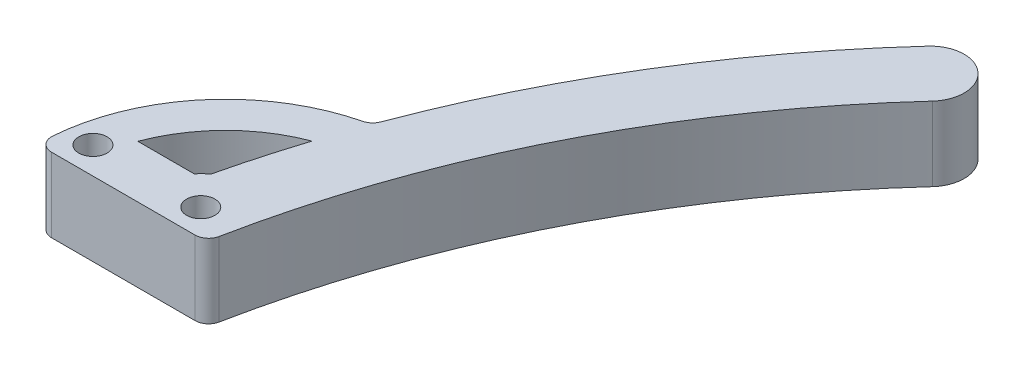
ISO-10303-21;
HEADER;
FILE_DESCRIPTION(('STEP AP214'),'2;1');
FILE_NAME('part.step','',(''),(''),'','','');
FILE_SCHEMA(('AUTOMOTIVE_DESIGN { 1 0 10303 214 1 1 1 1 }'));
ENDSEC;
DATA;
#1=APPLICATION_CONTEXT('core data for automotive mechanical design processes');
#2=APPLICATION_PROTOCOL_DEFINITION('international standard','automotive_design',2000,#1);
#3=PRODUCT_CONTEXT('',#1,'mechanical');
#4=PRODUCT('Part','Part','',(#3));
#5=PRODUCT_RELATED_PRODUCT_CATEGORY('part','',(#4));
#6=PRODUCT_DEFINITION_FORMATION('','',#4);
#7=PRODUCT_DEFINITION_CONTEXT('part definition',#1,'design');
#8=PRODUCT_DEFINITION('design','',#6,#7);
#9=PRODUCT_DEFINITION_SHAPE('','',#8);
#10=(LENGTH_UNIT() NAMED_UNIT(*) SI_UNIT(.MILLI.,.METRE.));
#11=(NAMED_UNIT(*) PLANE_ANGLE_UNIT() SI_UNIT($,.RADIAN.));
#12=(NAMED_UNIT(*) SI_UNIT($,.STERADIAN.) SOLID_ANGLE_UNIT());
#13=UNCERTAINTY_MEASURE_WITH_UNIT(LENGTH_MEASURE(1.E-05),#10,'distance_accuracy_value','');
#14=(GEOMETRIC_REPRESENTATION_CONTEXT(3) GLOBAL_UNCERTAINTY_ASSIGNED_CONTEXT((#13)) GLOBAL_UNIT_ASSIGNED_CONTEXT((#10,
#11,#12)) REPRESENTATION_CONTEXT('',''));
#15=CARTESIAN_POINT('',(0.,0.,0.));
#16=DIRECTION('',(0.,0.,1.));
#17=DIRECTION('',(1.,0.,0.));
#18=AXIS2_PLACEMENT_3D('',#15,#16,#17);
#19=CARTESIAN_POINT('',(-141.446102809515,11.,-27.));
#20=DIRECTION('',(0.,1.,0.));
#21=DIRECTION('',(0.,0.,1.));
#22=AXIS2_PLACEMENT_3D('',#19,#20,#21);
#23=PLANE('',#22);
#24=CARTESIAN_POINT('',(-149.101129521198,11.,-31.));
#25=DIRECTION('',(0.,1.,0.));
#26=DIRECTION('',(0.,0.,1.));
#27=AXIS2_PLACEMENT_3D('',#24,#25,#26);
#28=CIRCLE('',#27,2.09999999999999);
#29=CARTESIAN_POINT('',(-149.101129521198,11.,-28.9));
#30=VERTEX_POINT('',#29);
#31=EDGE_CURVE('E157',#30,#30,#28,.T.);
#32=ORIENTED_EDGE('',*,*,#31,.F.);
#33=EDGE_LOOP('',(#32));
#34=FACE_BOUND('',#33,.T.);
#35=CARTESIAN_POINT('',(-141.446102809515,11.,-27.));
#36=DIRECTION('',(0.,1.,0.));
#37=DIRECTION('',(0.,0.,1.));
#38=AXIS2_PLACEMENT_3D('',#35,#36,#37);
#39=CIRCLE('',#38,27.8705796636837);
#40=CARTESIAN_POINT('',(-148.107725738016,11.,-54.0627417448458));
#41=VERTEX_POINT('',#40);
#42=CARTESIAN_POINT('',(-169.23327325931,11.,-29.154615785653));
#43=VERTEX_POINT('',#42);
#44=EDGE_CURVE('E168',#41,#43,#39,.T.);
#45=ORIENTED_EDGE('',*,*,#44,.T.);
#46=CARTESIAN_POINT('',(-167.239258726057,11.,-29.));
#47=DIRECTION('',(0.,1.,0.));
#48=DIRECTION('',(0.,0.,1.));
#49=AXIS2_PLACEMENT_3D('',#46,#47,#48);
#50=CIRCLE('',#49,2.);
#51=CARTESIAN_POINT('',(-167.239258726057,11.,-27.));
#52=VERTEX_POINT('',#51);
#53=EDGE_CURVE('E214',#43,#52,#50,.T.);
#54=ORIENTED_EDGE('',*,*,#53,.T.);
#55=DIRECTION('',(1.,0.,0.));
#56=VECTOR('',#55,1.);
#57=CARTESIAN_POINT('',(-169.316682473199,11.,-27.));
#58=LINE('',#57,#56);
#59=CARTESIAN_POINT('',(-145.936507084417,11.,-27.));
#60=VERTEX_POINT('',#59);
#61=EDGE_CURVE('E171',#52,#60,#58,.T.);
#62=ORIENTED_EDGE('',*,*,#61,.T.);
#63=CARTESIAN_POINT('',(-145.936507084417,11.,-29.));
#64=DIRECTION('',(0.,1.,0.));
#65=DIRECTION('',(0.,0.,1.));
#66=AXIS2_PLACEMENT_3D('',#63,#64,#65);
#67=CIRCLE('',#66,2.);
#68=CARTESIAN_POINT('',(-143.974863061506,11.,-28.610188856778));
#69=VERTEX_POINT('',#68);
#70=EDGE_CURVE('E48',#60,#69,#67,.T.);
#71=ORIENTED_EDGE('',*,*,#70,.T.);
#72=CARTESIAN_POINT('',(0.,11.,0.));
#73=DIRECTION('',(0.,-1.,0.));
#74=DIRECTION('',(0.,0.,1.));
#75=AXIS2_PLACEMENT_3D('',#72,#73,#74);
#76=CIRCLE('',#75,146.79);
#77=CARTESIAN_POINT('',(-108.437297629025,11.,-98.937639869335));
#78=VERTEX_POINT('',#77);
#79=EDGE_CURVE('E174',#69,#78,#76,.T.);
#80=ORIENTED_EDGE('',*,*,#79,.T.);
#81=CARTESIAN_POINT('',(-112.130917685876,11.,-102.307680058358));
#82=DIRECTION('',(0.,1.,0.));
#83=DIRECTION('',(0.,0.,1.));
#84=AXIS2_PLACEMENT_3D('',#81,#82,#83);
#85=CIRCLE('',#84,5.);
#86=CARTESIAN_POINT('',(-115.824537742727,11.,-105.677720247381));
#87=VERTEX_POINT('',#86);
#88=EDGE_CURVE('E176',#78,#87,#85,.T.);
#89=ORIENTED_EDGE('',*,*,#88,.T.);
#90=CARTESIAN_POINT('',(0.,11.,0.));
#91=DIRECTION('',(0.,1.,0.));
#92=DIRECTION('',(0.,0.,1.));
#93=AXIS2_PLACEMENT_3D('',#90,#91,#92);
#94=CIRCLE('',#93,156.79);
#95=CARTESIAN_POINT('',(-146.714290421652,11.,-55.2993769049094));
#96=VERTEX_POINT('',#95);
#97=EDGE_CURVE('E178',#87,#96,#94,.T.);
#98=ORIENTED_EDGE('',*,*,#97,.T.);
#99=CARTESIAN_POINT('',(-148.585765521105,11.,-56.0047710869989));
#100=DIRECTION('',(0.,1.,0.));
#101=DIRECTION('',(0.,0.,1.));
#102=AXIS2_PLACEMENT_3D('',#99,#100,#101);
#103=CIRCLE('',#102,2.);
#104=EDGE_CURVE('E11',#96,#41,#103,.F.);
#105=ORIENTED_EDGE('',*,*,#104,.T.);
#106=EDGE_LOOP('',(#45,#54,#62,#71,#80,#89,#98,#105));
#107=FACE_BOUND('',#106,.T.);
#108=DIRECTION('',(1.,0.,0.));
#109=VECTOR('',#108,1.);
#110=CARTESIAN_POINT('',(-162.242742421165,11.,-34.7972264792956));
#111=LINE('',#110,#109);
#112=CARTESIAN_POINT('',(-162.242742421165,11.,-34.7972264792956));
#113=VERTEX_POINT('',#112);
#114=CARTESIAN_POINT('',(-153.870589387154,11.,-34.7972264792956));
#115=VERTEX_POINT('',#114);
#116=EDGE_CURVE('E134',#113,#115,#111,.T.);
#117=ORIENTED_EDGE('',*,*,#116,.F.);
#118=CARTESIAN_POINT('',(-141.446102809515,11.,-27.));
#119=DIRECTION('',(0.,1.,0.));
#120=DIRECTION('',(0.,0.,1.));
#121=AXIS2_PLACEMENT_3D('',#118,#119,#120);
#122=CIRCLE('',#121,22.2102895052328);
#123=CARTESIAN_POINT('',(-149.338618997014,11.,-47.7606634801572));
#124=VERTEX_POINT('',#123);
#125=EDGE_CURVE('E124',#124,#113,#122,.T.);
#126=ORIENTED_EDGE('',*,*,#125,.F.);
#127=CARTESIAN_POINT('',(0.,11.,0.));
#128=DIRECTION('',(0.,-1.,0.));
#129=DIRECTION('',(0.,0.,1.));
#130=AXIS2_PLACEMENT_3D('',#127,#128,#129);
#131=CIRCLE('',#130,156.79);
#132=CARTESIAN_POINT('',(-152.603484101656,11.,-35.9900088918527));
#133=VERTEX_POINT('',#132);
#134=EDGE_CURVE('E150',#133,#124,#131,.T.);
#135=ORIENTED_EDGE('',*,*,#134,.F.);
#136=CARTESIAN_POINT('',(-149.101129521198,11.,-31.));
#137=DIRECTION('',(0.,-1.,0.));
#138=DIRECTION('',(0.,0.,1.));
#139=AXIS2_PLACEMENT_3D('',#136,#137,#138);
#140=CIRCLE('',#139,6.09644784674009);
#141=EDGE_CURVE('E148',#115,#133,#140,.T.);
#142=ORIENTED_EDGE('',*,*,#141,.F.);
#143=EDGE_LOOP('',(#117,#126,#135,#142));
#144=FACE_BOUND('',#143,.T.);
#145=CARTESIAN_POINT('',(-165.101129521198,11.,-31.));
#146=DIRECTION('',(0.,1.,0.));
#147=DIRECTION('',(0.,0.,1.));
#148=AXIS2_PLACEMENT_3D('',#145,#146,#147);
#149=CIRCLE('',#148,2.09999999999999);
#150=CARTESIAN_POINT('',(-165.101129521198,11.,-28.9));
#151=VERTEX_POINT('',#150);
#152=EDGE_CURVE('E294',#151,#151,#149,.T.);
#153=ORIENTED_EDGE('',*,*,#152,.F.);
#154=EDGE_LOOP('',(#153));
#155=FACE_BOUND('',#154,.T.);
#156=ADVANCED_FACE('F33',(#34,#107,#144,#155),#23,.T.);
#157=CARTESIAN_POINT('',(-141.446102809515,0.,-27.));
#158=DIRECTION('',(0.,1.,0.));
#159=DIRECTION('',(0.,0.,1.));
#160=AXIS2_PLACEMENT_3D('',#157,#158,#159);
#161=PLANE('',#160);
#162=DIRECTION('',(1.,0.,0.));
#163=VECTOR('',#162,1.);
#164=CARTESIAN_POINT('',(-169.316682473199,0.,-27.));
#165=LINE('',#164,#163);
#166=CARTESIAN_POINT('',(-167.239258726057,0.,-27.));
#167=VERTEX_POINT('',#166);
#168=CARTESIAN_POINT('',(-145.936507084417,0.,-27.));
#169=VERTEX_POINT('',#168);
#170=EDGE_CURVE('E184',#167,#169,#165,.T.);
#171=ORIENTED_EDGE('',*,*,#170,.F.);
#172=CARTESIAN_POINT('',(-167.239258726057,0.,-29.));
#173=DIRECTION('',(0.,1.,0.));
#174=DIRECTION('',(0.,0.,1.));
#175=AXIS2_PLACEMENT_3D('',#172,#173,#174);
#176=CIRCLE('',#175,2.);
#177=CARTESIAN_POINT('',(-169.23327325931,0.,-29.154615785653));
#178=VERTEX_POINT('',#177);
#179=EDGE_CURVE('E211',#167,#178,#176,.F.);
#180=ORIENTED_EDGE('',*,*,#179,.T.);
#181=CARTESIAN_POINT('',(-141.446102809515,0.,-27.));
#182=DIRECTION('',(0.,1.,0.));
#183=DIRECTION('',(0.,0.,1.));
#184=AXIS2_PLACEMENT_3D('',#181,#182,#183);
#185=CIRCLE('',#184,27.8705796636837);
#186=CARTESIAN_POINT('',(-148.107725738016,0.,-54.0627417448458));
#187=VERTEX_POINT('',#186);
#188=EDGE_CURVE('E142',#187,#178,#185,.T.);
#189=ORIENTED_EDGE('',*,*,#188,.F.);
#190=CARTESIAN_POINT('',(-148.585765521105,0.,-56.0047710869989));
#191=DIRECTION('',(0.,1.,0.));
#192=DIRECTION('',(0.,0.,1.));
#193=AXIS2_PLACEMENT_3D('',#190,#191,#192);
#194=CIRCLE('',#193,2.);
#195=CARTESIAN_POINT('',(-146.714290421652,0.,-55.2993769049094));
#196=VERTEX_POINT('',#195);
#197=EDGE_CURVE('E41',#187,#196,#194,.T.);
#198=ORIENTED_EDGE('',*,*,#197,.T.);
#199=CARTESIAN_POINT('',(0.,0.,0.));
#200=DIRECTION('',(0.,1.,0.));
#201=DIRECTION('',(0.,0.,1.));
#202=AXIS2_PLACEMENT_3D('',#199,#200,#201);
#203=CIRCLE('',#202,156.79);
#204=CARTESIAN_POINT('',(-115.824537742727,0.,-105.677720247381));
#205=VERTEX_POINT('',#204);
#206=EDGE_CURVE('E172',#205,#196,#203,.T.);
#207=ORIENTED_EDGE('',*,*,#206,.F.);
#208=CARTESIAN_POINT('',(-112.130917685876,0.,-102.307680058358));
#209=DIRECTION('',(0.,1.,0.));
#210=DIRECTION('',(0.,0.,1.));
#211=AXIS2_PLACEMENT_3D('',#208,#209,#210);
#212=CIRCLE('',#211,5.);
#213=CARTESIAN_POINT('',(-108.437297629025,0.,-98.937639869335));
#214=VERTEX_POINT('',#213);
#215=EDGE_CURVE('E189',#214,#205,#212,.T.);
#216=ORIENTED_EDGE('',*,*,#215,.F.);
#217=CARTESIAN_POINT('',(0.,0.,0.));
#218=DIRECTION('',(0.,-1.,0.));
#219=DIRECTION('',(0.,0.,1.));
#220=AXIS2_PLACEMENT_3D('',#217,#218,#219);
#221=CIRCLE('',#220,146.79);
#222=CARTESIAN_POINT('',(-143.974863061506,0.,-28.610188856778));
#223=VERTEX_POINT('',#222);
#224=EDGE_CURVE('E187',#223,#214,#221,.T.);
#225=ORIENTED_EDGE('',*,*,#224,.F.);
#226=CARTESIAN_POINT('',(-145.936507084417,0.,-29.));
#227=DIRECTION('',(0.,1.,0.));
#228=DIRECTION('',(0.,0.,1.));
#229=AXIS2_PLACEMENT_3D('',#226,#227,#228);
#230=CIRCLE('',#229,2.);
#231=EDGE_CURVE('E56',#223,#169,#230,.F.);
#232=ORIENTED_EDGE('',*,*,#231,.T.);
#233=EDGE_LOOP('',(#171,#180,#189,#198,#207,#216,#225,#232));
#234=FACE_BOUND('',#233,.T.);
#235=CARTESIAN_POINT('',(-141.446102809515,0.,-27.));
#236=DIRECTION('',(0.,1.,0.));
#237=DIRECTION('',(0.,0.,1.));
#238=AXIS2_PLACEMENT_3D('',#235,#236,#237);
#239=CIRCLE('',#238,22.2102895052328);
#240=CARTESIAN_POINT('',(-149.338618997014,0.,-47.7606634801572));
#241=VERTEX_POINT('',#240);
#242=CARTESIAN_POINT('',(-162.242742421165,0.,-34.7972264792956));
#243=VERTEX_POINT('',#242);
#244=EDGE_CURVE('E155',#241,#243,#239,.T.);
#245=ORIENTED_EDGE('',*,*,#244,.T.);
#246=DIRECTION('',(1.,0.,0.));
#247=VECTOR('',#246,1.);
#248=CARTESIAN_POINT('',(-162.242742421165,0.,-34.7972264792956));
#249=LINE('',#248,#247);
#250=CARTESIAN_POINT('',(-153.870589387154,0.,-34.7972264792956));
#251=VERTEX_POINT('',#250);
#252=EDGE_CURVE('E141',#243,#251,#249,.T.);
#253=ORIENTED_EDGE('',*,*,#252,.T.);
#254=CARTESIAN_POINT('',(-149.101129521198,0.,-31.));
#255=DIRECTION('',(0.,-1.,0.));
#256=DIRECTION('',(0.,0.,1.));
#257=AXIS2_PLACEMENT_3D('',#254,#255,#256);
#258=CIRCLE('',#257,6.09644784674009);
#259=CARTESIAN_POINT('',(-152.603484101656,0.,-35.9900088918527));
#260=VERTEX_POINT('',#259);
#261=EDGE_CURVE('E159',#251,#260,#258,.T.);
#262=ORIENTED_EDGE('',*,*,#261,.T.);
#263=CARTESIAN_POINT('',(0.,0.,0.));
#264=DIRECTION('',(0.,-1.,0.));
#265=DIRECTION('',(0.,0.,1.));
#266=AXIS2_PLACEMENT_3D('',#263,#264,#265);
#267=CIRCLE('',#266,156.79);
#268=EDGE_CURVE('E135',#260,#241,#267,.T.);
#269=ORIENTED_EDGE('',*,*,#268,.T.);
#270=EDGE_LOOP('',(#245,#253,#262,#269));
#271=FACE_BOUND('',#270,.T.);
#272=CARTESIAN_POINT('',(-149.101129521198,0.,-31.));
#273=DIRECTION('',(0.,1.,0.));
#274=DIRECTION('',(0.,0.,1.));
#275=AXIS2_PLACEMENT_3D('',#272,#273,#274);
#276=CIRCLE('',#275,2.09999999999999);
#277=CARTESIAN_POINT('',(-149.101129521198,0.,-28.9));
#278=VERTEX_POINT('',#277);
#279=EDGE_CURVE('E300',#278,#278,#276,.T.);
#280=ORIENTED_EDGE('',*,*,#279,.T.);
#281=EDGE_LOOP('',(#280));
#282=FACE_BOUND('',#281,.T.);
#283=CARTESIAN_POINT('',(-165.101129521198,0.,-31.));
#284=DIRECTION('',(0.,1.,0.));
#285=DIRECTION('',(0.,0.,1.));
#286=AXIS2_PLACEMENT_3D('',#283,#284,#285);
#287=CIRCLE('',#286,2.09999999999999);
#288=CARTESIAN_POINT('',(-165.101129521198,0.,-28.9));
#289=VERTEX_POINT('',#288);
#290=EDGE_CURVE('E297',#289,#289,#287,.T.);
#291=ORIENTED_EDGE('',*,*,#290,.T.);
#292=EDGE_LOOP('',(#291));
#293=FACE_BOUND('',#292,.T.);
#294=ADVANCED_FACE('F221',(#234,#271,#282,#293),#161,.F.);
#295=CARTESIAN_POINT('',(-141.446102809515,11.,-27.));
#296=DIRECTION('',(0.,-1.,0.));
#297=DIRECTION('',(0.,0.,-1.));
#298=AXIS2_PLACEMENT_3D('',#295,#296,#297);
#299=CYLINDRICAL_SURFACE('',#298,27.8705796636837);
#300=ORIENTED_EDGE('',*,*,#44,.F.);
#301=DIRECTION('',(0.,-1.,0.));
#302=VECTOR('',#301,1.);
#303=CARTESIAN_POINT('',(-148.107725738016,11.,-54.0627417448458));
#304=LINE('',#303,#302);
#305=EDGE_CURVE('E200',#41,#187,#304,.T.);
#306=ORIENTED_EDGE('',*,*,#305,.T.);
#307=ORIENTED_EDGE('',*,*,#188,.T.);
#308=DIRECTION('',(0.,-1.,0.));
#309=VECTOR('',#308,1.);
#310=CARTESIAN_POINT('',(-169.23327325931,11.,-29.154615785653));
#311=LINE('',#310,#309);
#312=EDGE_CURVE('E198',#178,#43,#311,.F.);
#313=ORIENTED_EDGE('',*,*,#312,.T.);
#314=EDGE_LOOP('',(#300,#306,#307,#313));
#315=FACE_BOUND('',#314,.T.);
#316=ADVANCED_FACE('F236',(#315),#299,.T.);
#317=CARTESIAN_POINT('',(-169.316682473199,11.,-27.));
#318=DIRECTION('',(0.,0.,-1.));
#319=DIRECTION('',(-1.,0.,0.));
#320=AXIS2_PLACEMENT_3D('',#317,#318,#319);
#321=PLANE('',#320);
#322=ORIENTED_EDGE('',*,*,#61,.F.);
#323=DIRECTION('',(0.,-1.,0.));
#324=VECTOR('',#323,1.);
#325=CARTESIAN_POINT('',(-167.239258726057,11.,-27.));
#326=LINE('',#325,#324);
#327=EDGE_CURVE('E207',#52,#167,#326,.T.);
#328=ORIENTED_EDGE('',*,*,#327,.T.);
#329=ORIENTED_EDGE('',*,*,#170,.T.);
#330=DIRECTION('',(0.,-1.,0.));
#331=VECTOR('',#330,1.);
#332=CARTESIAN_POINT('',(-145.936507084417,11.,-27.));
#333=LINE('',#332,#331);
#334=EDGE_CURVE('E205',#169,#60,#333,.F.);
#335=ORIENTED_EDGE('',*,*,#334,.T.);
#336=EDGE_LOOP('',(#322,#328,#329,#335));
#337=FACE_BOUND('',#336,.T.);
#338=ADVANCED_FACE('F243',(#337),#321,.F.);
#339=CARTESIAN_POINT('',(0.,11.,0.));
#340=DIRECTION('',(0.,-1.,0.));
#341=DIRECTION('',(0.,0.,-1.));
#342=AXIS2_PLACEMENT_3D('',#339,#340,#341);
#343=CYLINDRICAL_SURFACE('',#342,146.79);
#344=ORIENTED_EDGE('',*,*,#79,.F.);
#345=DIRECTION('',(0.,-1.,0.));
#346=VECTOR('',#345,1.);
#347=CARTESIAN_POINT('',(-143.974863061506,11.,-28.610188856778));
#348=LINE('',#347,#346);
#349=EDGE_CURVE('E216',#69,#223,#348,.T.);
#350=ORIENTED_EDGE('',*,*,#349,.T.);
#351=ORIENTED_EDGE('',*,*,#224,.T.);
#352=DIRECTION('',(0.,-1.,0.));
#353=VECTOR('',#352,1.);
#354=CARTESIAN_POINT('',(-108.437297629025,11.,-98.937639869335));
#355=LINE('',#354,#353);
#356=EDGE_CURVE('E195',#78,#214,#355,.T.);
#357=ORIENTED_EDGE('',*,*,#356,.F.);
#358=EDGE_LOOP('',(#344,#350,#351,#357));
#359=FACE_BOUND('',#358,.T.);
#360=ADVANCED_FACE('F246',(#359),#343,.F.);
#361=CARTESIAN_POINT('',(-112.130917685876,11.,-102.307680058358));
#362=DIRECTION('',(0.,-1.,0.));
#363=DIRECTION('',(0.,0.,-1.));
#364=AXIS2_PLACEMENT_3D('',#361,#362,#363);
#365=CYLINDRICAL_SURFACE('',#364,5.);
#366=ORIENTED_EDGE('',*,*,#215,.T.);
#367=DIRECTION('',(0.,-1.,0.));
#368=VECTOR('',#367,1.);
#369=CARTESIAN_POINT('',(-115.824537742727,11.,-105.677720247381));
#370=LINE('',#369,#368);
#371=EDGE_CURVE('E181',#87,#205,#370,.T.);
#372=ORIENTED_EDGE('',*,*,#371,.F.);
#373=ORIENTED_EDGE('',*,*,#88,.F.);
#374=ORIENTED_EDGE('',*,*,#356,.T.);
#375=EDGE_LOOP('',(#366,#372,#373,#374));
#376=FACE_BOUND('',#375,.T.);
#377=ADVANCED_FACE('F249',(#376),#365,.T.);
#378=CARTESIAN_POINT('',(0.,11.,0.));
#379=DIRECTION('',(0.,-1.,0.));
#380=DIRECTION('',(0.,0.,-1.));
#381=AXIS2_PLACEMENT_3D('',#378,#379,#380);
#382=CYLINDRICAL_SURFACE('',#381,156.79);
#383=ORIENTED_EDGE('',*,*,#206,.T.);
#384=DIRECTION('',(0.,-1.,0.));
#385=VECTOR('',#384,1.);
#386=CARTESIAN_POINT('',(-146.714290421652,11.,-55.2993769049094));
#387=LINE('',#386,#385);
#388=EDGE_CURVE('E203',#196,#96,#387,.F.);
#389=ORIENTED_EDGE('',*,*,#388,.T.);
#390=ORIENTED_EDGE('',*,*,#97,.F.);
#391=ORIENTED_EDGE('',*,*,#371,.T.);
#392=EDGE_LOOP('',(#383,#389,#390,#391));
#393=FACE_BOUND('',#392,.T.);
#394=ADVANCED_FACE('F228',(#393),#382,.T.);
#395=CARTESIAN_POINT('',(-141.446102809515,11.,-27.));
#396=DIRECTION('',(0.,-1.,0.));
#397=DIRECTION('',(0.,0.,-1.));
#398=AXIS2_PLACEMENT_3D('',#395,#396,#397);
#399=CYLINDRICAL_SURFACE('',#398,22.2102895052328);
#400=ORIENTED_EDGE('',*,*,#244,.F.);
#401=DIRECTION('',(0.,-1.,0.));
#402=VECTOR('',#401,1.);
#403=CARTESIAN_POINT('',(-149.338618997014,11.,-47.7606634801572));
#404=LINE('',#403,#402);
#405=EDGE_CURVE('E130',#124,#241,#404,.T.);
#406=ORIENTED_EDGE('',*,*,#405,.F.);
#407=ORIENTED_EDGE('',*,*,#125,.T.);
#408=DIRECTION('',(0.,-1.,0.));
#409=VECTOR('',#408,1.);
#410=CARTESIAN_POINT('',(-162.242742421165,11.,-34.7972264792956));
#411=LINE('',#410,#409);
#412=EDGE_CURVE('E127',#113,#243,#411,.T.);
#413=ORIENTED_EDGE('',*,*,#412,.T.);
#414=EDGE_LOOP('',(#400,#406,#407,#413));
#415=FACE_BOUND('',#414,.T.);
#416=ADVANCED_FACE('F126',(#415),#399,.F.);
#417=CARTESIAN_POINT('',(-162.242742421165,11.,-34.7972264792956));
#418=DIRECTION('',(0.,0.,-1.));
#419=DIRECTION('',(-1.,0.,0.));
#420=AXIS2_PLACEMENT_3D('',#417,#418,#419);
#421=PLANE('',#420);
#422=ORIENTED_EDGE('',*,*,#252,.F.);
#423=ORIENTED_EDGE('',*,*,#412,.F.);
#424=ORIENTED_EDGE('',*,*,#116,.T.);
#425=DIRECTION('',(0.,-1.,0.));
#426=VECTOR('',#425,1.);
#427=CARTESIAN_POINT('',(-153.870589387154,11.,-34.7972264792956));
#428=LINE('',#427,#426);
#429=EDGE_CURVE('E143',#115,#251,#428,.T.);
#430=ORIENTED_EDGE('',*,*,#429,.T.);
#431=EDGE_LOOP('',(#422,#423,#424,#430));
#432=FACE_BOUND('',#431,.T.);
#433=ADVANCED_FACE('F138',(#432),#421,.T.);
#434=CARTESIAN_POINT('',(-149.101129521198,11.,-31.));
#435=DIRECTION('',(0.,-1.,0.));
#436=DIRECTION('',(0.,0.,-1.));
#437=AXIS2_PLACEMENT_3D('',#434,#435,#436);
#438=CYLINDRICAL_SURFACE('',#437,6.09644784674009);
#439=ORIENTED_EDGE('',*,*,#261,.F.);
#440=ORIENTED_EDGE('',*,*,#429,.F.);
#441=ORIENTED_EDGE('',*,*,#141,.T.);
#442=DIRECTION('',(0.,-1.,0.));
#443=VECTOR('',#442,1.);
#444=CARTESIAN_POINT('',(-152.603484101656,11.,-35.9900088918527));
#445=LINE('',#444,#443);
#446=EDGE_CURVE('E165',#133,#260,#445,.T.);
#447=ORIENTED_EDGE('',*,*,#446,.T.);
#448=EDGE_LOOP('',(#439,#440,#441,#447));
#449=FACE_BOUND('',#448,.T.);
#450=ADVANCED_FACE('F272',(#449),#438,.T.);
#451=CARTESIAN_POINT('',(0.,11.,0.));
#452=DIRECTION('',(0.,-1.,0.));
#453=DIRECTION('',(0.,0.,-1.));
#454=AXIS2_PLACEMENT_3D('',#451,#452,#453);
#455=CYLINDRICAL_SURFACE('',#454,156.79);
#456=ORIENTED_EDGE('',*,*,#268,.F.);
#457=ORIENTED_EDGE('',*,*,#446,.F.);
#458=ORIENTED_EDGE('',*,*,#134,.T.);
#459=ORIENTED_EDGE('',*,*,#405,.T.);
#460=EDGE_LOOP('',(#456,#457,#458,#459));
#461=FACE_BOUND('',#460,.T.);
#462=ADVANCED_FACE('F275',(#461),#455,.T.);
#463=CARTESIAN_POINT('',(-149.101129521198,11.,-31.));
#464=DIRECTION('',(0.,-1.,0.));
#465=DIRECTION('',(0.,0.,-1.));
#466=AXIS2_PLACEMENT_3D('',#463,#464,#465);
#467=CYLINDRICAL_SURFACE('',#466,2.09999999999999);
#468=ORIENTED_EDGE('',*,*,#31,.T.);
#469=EDGE_LOOP('',(#468));
#470=FACE_BOUND('',#469,.T.);
#471=ORIENTED_EDGE('',*,*,#279,.F.);
#472=EDGE_LOOP('',(#471));
#473=FACE_BOUND('',#472,.T.);
#474=ADVANCED_FACE('F279',(#470,#473),#467,.F.);
#475=CARTESIAN_POINT('',(-165.101129521198,11.,-31.));
#476=DIRECTION('',(0.,-1.,0.));
#477=DIRECTION('',(0.,0.,-1.));
#478=AXIS2_PLACEMENT_3D('',#475,#476,#477);
#479=CYLINDRICAL_SURFACE('',#478,2.09999999999999);
#480=ORIENTED_EDGE('',*,*,#152,.T.);
#481=EDGE_LOOP('',(#480));
#482=FACE_BOUND('',#481,.T.);
#483=ORIENTED_EDGE('',*,*,#290,.F.);
#484=EDGE_LOOP('',(#483));
#485=FACE_BOUND('',#484,.T.);
#486=ADVANCED_FACE('F283',(#482,#485),#479,.F.);
#487=CARTESIAN_POINT('',(-148.585765521105,11.,-56.0047710869989));
#488=DIRECTION('',(0.,1.,0.));
#489=DIRECTION('',(0.,0.,1.));
#490=AXIS2_PLACEMENT_3D('',#487,#488,#489);
#491=CYLINDRICAL_SURFACE('',#490,2.);
#492=ORIENTED_EDGE('',*,*,#104,.F.);
#493=ORIENTED_EDGE('',*,*,#388,.F.);
#494=ORIENTED_EDGE('',*,*,#197,.F.);
#495=ORIENTED_EDGE('',*,*,#305,.F.);
#496=EDGE_LOOP('',(#492,#493,#494,#495));
#497=FACE_BOUND('',#496,.T.);
#498=ADVANCED_FACE('F232',(#497),#491,.F.);
#499=CARTESIAN_POINT('',(-167.239258726057,11.,-29.));
#500=DIRECTION('',(0.,-1.,0.));
#501=DIRECTION('',(0.,0.,-1.));
#502=AXIS2_PLACEMENT_3D('',#499,#500,#501);
#503=CYLINDRICAL_SURFACE('',#502,2.);
#504=ORIENTED_EDGE('',*,*,#53,.F.);
#505=ORIENTED_EDGE('',*,*,#312,.F.);
#506=ORIENTED_EDGE('',*,*,#179,.F.);
#507=ORIENTED_EDGE('',*,*,#327,.F.);
#508=EDGE_LOOP('',(#504,#505,#506,#507));
#509=FACE_BOUND('',#508,.T.);
#510=ADVANCED_FACE('F239',(#509),#503,.T.);
#511=CARTESIAN_POINT('',(-145.936507084417,11.,-29.));
#512=DIRECTION('',(0.,-1.,0.));
#513=DIRECTION('',(0.,0.,-1.));
#514=AXIS2_PLACEMENT_3D('',#511,#512,#513);
#515=CYLINDRICAL_SURFACE('',#514,2.);
#516=ORIENTED_EDGE('',*,*,#70,.F.);
#517=ORIENTED_EDGE('',*,*,#334,.F.);
#518=ORIENTED_EDGE('',*,*,#231,.F.);
#519=ORIENTED_EDGE('',*,*,#349,.F.);
#520=EDGE_LOOP('',(#516,#517,#518,#519));
#521=FACE_BOUND('',#520,.T.);
#522=ADVANCED_FACE('F35',(#521),#515,.T.);
#523=CLOSED_SHELL('',(#156,#294,#316,#338,#360,#377,#394,#416,#433,#450,#462,#474,#486,#498,
#510,#522));
#524=MANIFOLD_SOLID_BREP('B2',#523);
#525=ADVANCED_BREP_SHAPE_REPRESENTATION('',(#18,#524),#14);
#526=SHAPE_DEFINITION_REPRESENTATION(#9,#525);
ENDSEC;
END-ISO-10303-21;
